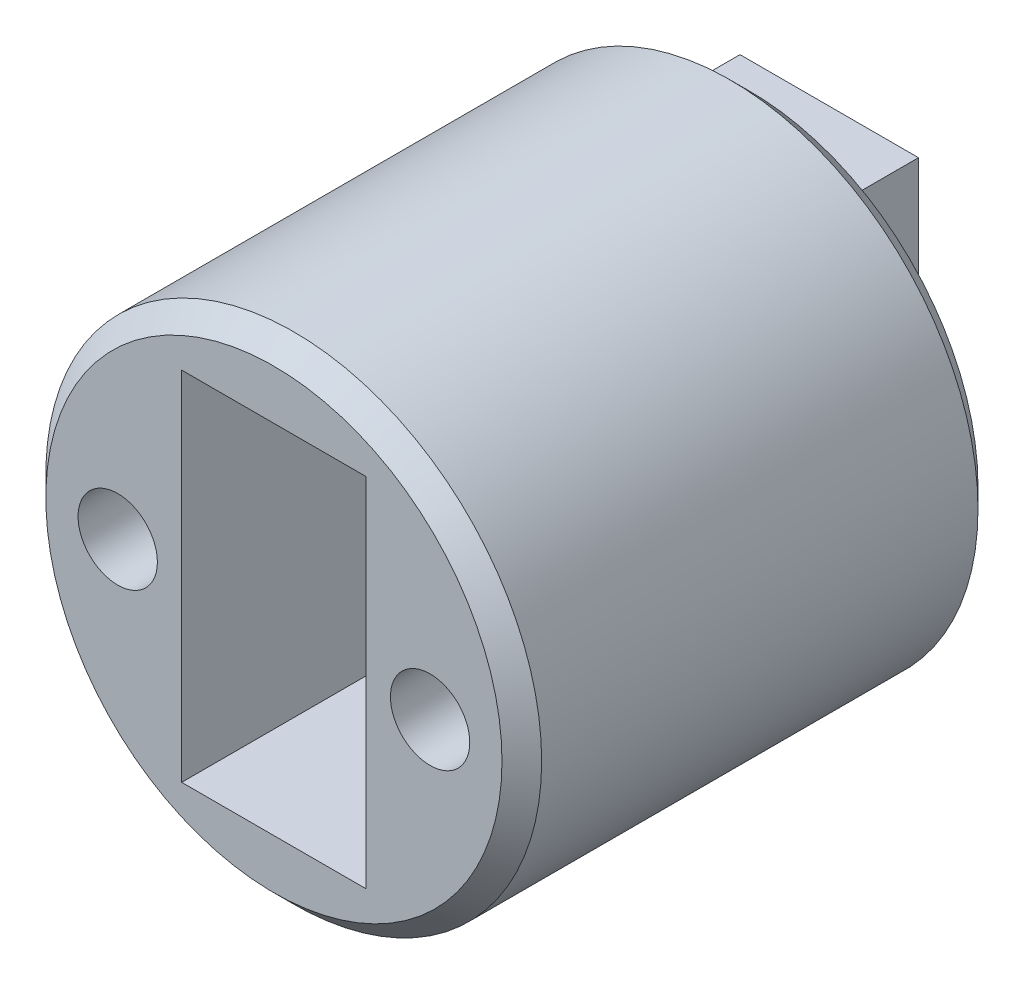
ISO-10303-21;
HEADER;
FILE_DESCRIPTION(('STEP AP214'),'2;1');
FILE_NAME('part.step','',(''),(''),'','','');
FILE_SCHEMA(('AUTOMOTIVE_DESIGN { 1 0 10303 214 1 1 1 1 }'));
ENDSEC;
DATA;
#1=APPLICATION_CONTEXT('core data for automotive mechanical design processes');
#2=APPLICATION_PROTOCOL_DEFINITION('international standard','automotive_design',2000,#1);
#3=PRODUCT_CONTEXT('',#1,'mechanical');
#4=PRODUCT('Part','Part','',(#3));
#5=PRODUCT_RELATED_PRODUCT_CATEGORY('part','',(#4));
#6=PRODUCT_DEFINITION_FORMATION('','',#4);
#7=PRODUCT_DEFINITION_CONTEXT('part definition',#1,'design');
#8=PRODUCT_DEFINITION('design','',#6,#7);
#9=PRODUCT_DEFINITION_SHAPE('','',#8);
#10=(LENGTH_UNIT() NAMED_UNIT(*) SI_UNIT(.MILLI.,.METRE.));
#11=(NAMED_UNIT(*) PLANE_ANGLE_UNIT() SI_UNIT($,.RADIAN.));
#12=(NAMED_UNIT(*) SI_UNIT($,.STERADIAN.) SOLID_ANGLE_UNIT());
#13=UNCERTAINTY_MEASURE_WITH_UNIT(LENGTH_MEASURE(1.E-05),#10,'distance_accuracy_value','');
#14=(GEOMETRIC_REPRESENTATION_CONTEXT(3) GLOBAL_UNCERTAINTY_ASSIGNED_CONTEXT((#13)) GLOBAL_UNIT_ASSIGNED_CONTEXT((#10,
#11,#12)) REPRESENTATION_CONTEXT('',''));
#15=CARTESIAN_POINT('',(0.,0.,0.));
#16=DIRECTION('',(0.,0.,1.));
#17=DIRECTION('',(1.,0.,0.));
#18=AXIS2_PLACEMENT_3D('',#15,#16,#17);
#19=CARTESIAN_POINT('',(0.,0.,6.));
#20=DIRECTION('',(0.,0.,1.));
#21=DIRECTION('',(1.,0.,0.));
#22=AXIS2_PLACEMENT_3D('',#19,#20,#21);
#23=PLANE('',#22);
#24=DIRECTION('',(-1.,0.,0.));
#25=VECTOR('',#24,1.);
#26=CARTESIAN_POINT('',(-3.,7.,6.));
#27=LINE('',#26,#25);
#28=CARTESIAN_POINT('',(2.69999999999997,7.,6.));
#29=VERTEX_POINT('',#28);
#30=CARTESIAN_POINT('',(-2.69999999999997,7.,6.));
#31=VERTEX_POINT('',#30);
#32=EDGE_CURVE('E196',#29,#31,#27,.T.);
#33=ORIENTED_EDGE('',*,*,#32,.F.);
#34=DIRECTION('',(0.,1.,0.));
#35=VECTOR('',#34,1.);
#36=CARTESIAN_POINT('',(2.69999999999997,0.,6.));
#37=LINE('',#36,#35);
#38=CARTESIAN_POINT('',(2.69999999999997,7.04999999999996,6.));
#39=VERTEX_POINT('',#38);
#40=EDGE_CURVE('E357',#29,#39,#37,.T.);
#41=ORIENTED_EDGE('',*,*,#40,.T.);
#42=DIRECTION('',(-1.,0.,0.));
#43=VECTOR('',#42,1.);
#44=CARTESIAN_POINT('',(0.,7.04999999999996,6.));
#45=LINE('',#44,#43);
#46=CARTESIAN_POINT('',(-2.69999999999997,7.04999999999996,6.));
#47=VERTEX_POINT('',#46);
#48=EDGE_CURVE('E354',#39,#47,#45,.T.);
#49=ORIENTED_EDGE('',*,*,#48,.T.);
#50=DIRECTION('',(0.,-1.,0.));
#51=VECTOR('',#50,1.);
#52=CARTESIAN_POINT('',(-2.69999999999997,0.,6.));
#53=LINE('',#52,#51);
#54=EDGE_CURVE('E351',#47,#31,#53,.T.);
#55=ORIENTED_EDGE('',*,*,#54,.T.);
#56=EDGE_LOOP('',(#33,#41,#49,#55));
#57=FACE_BOUND('',#56,.T.);
#58=ADVANCED_FACE('F40',(#57),#23,.T.);
#59=CARTESIAN_POINT('',(0.,0.,0.));
#60=DIRECTION('',(0.,0.,1.));
#61=DIRECTION('',(1.,0.,0.));
#62=AXIS2_PLACEMENT_3D('',#59,#60,#61);
#63=PLANE('',#62);
#64=CARTESIAN_POINT('',(-7.875,0.,0.));
#65=DIRECTION('',(0.,0.,1.));
#66=DIRECTION('',(1.,0.,0.));
#67=AXIS2_PLACEMENT_3D('',#64,#65,#66);
#68=CIRCLE('',#67,2.);
#69=CARTESIAN_POINT('',(-5.875,0.,0.));
#70=VERTEX_POINT('',#69);
#71=EDGE_CURVE('E225',#70,#70,#68,.T.);
#72=ORIENTED_EDGE('',*,*,#71,.T.);
#73=EDGE_LOOP('',(#72));
#74=FACE_BOUND('',#73,.T.);
#75=CARTESIAN_POINT('',(7.875,0.,0.));
#76=DIRECTION('',(0.,0.,1.));
#77=DIRECTION('',(1.,0.,0.));
#78=AXIS2_PLACEMENT_3D('',#75,#76,#77);
#79=CIRCLE('',#78,2.);
#80=CARTESIAN_POINT('',(9.875,0.,0.));
#81=VERTEX_POINT('',#80);
#82=EDGE_CURVE('E218',#81,#81,#79,.T.);
#83=ORIENTED_EDGE('',*,*,#82,.T.);
#84=EDGE_LOOP('',(#83));
#85=FACE_BOUND('',#84,.T.);
#86=CARTESIAN_POINT('',(0.,0.,0.));
#87=DIRECTION('',(0.,0.,1.));
#88=DIRECTION('',(1.,0.,0.));
#89=AXIS2_PLACEMENT_3D('',#86,#87,#88);
#90=CIRCLE('',#89,11.5);
#91=CARTESIAN_POINT('',(11.5,0.,0.));
#92=VERTEX_POINT('',#91);
#93=EDGE_CURVE('E329',#92,#92,#90,.F.);
#94=ORIENTED_EDGE('',*,*,#93,.T.);
#95=EDGE_LOOP('',(#94));
#96=FACE_BOUND('',#95,.T.);
#97=DIRECTION('',(0.,1.,0.));
#98=VECTOR('',#97,1.);
#99=CARTESIAN_POINT('',(-4.5,8.85,0.));
#100=LINE('',#99,#98);
#101=CARTESIAN_POINT('',(-4.5,-8.85,0.));
#102=VERTEX_POINT('',#101);
#103=CARTESIAN_POINT('',(-4.5,8.85,0.));
#104=VERTEX_POINT('',#103);
#105=EDGE_CURVE('E230',#102,#104,#100,.T.);
#106=ORIENTED_EDGE('',*,*,#105,.F.);
#107=DIRECTION('',(-1.,0.,0.));
#108=VECTOR('',#107,1.);
#109=CARTESIAN_POINT('',(4.5,-8.85,0.));
#110=LINE('',#109,#108);
#111=CARTESIAN_POINT('',(4.5,-8.85,0.));
#112=VERTEX_POINT('',#111);
#113=EDGE_CURVE('E243',#112,#102,#110,.T.);
#114=ORIENTED_EDGE('',*,*,#113,.F.);
#115=DIRECTION('',(0.,-1.,0.));
#116=VECTOR('',#115,1.);
#117=CARTESIAN_POINT('',(4.5,8.85,0.));
#118=LINE('',#117,#116);
#119=CARTESIAN_POINT('',(4.5,8.85,0.));
#120=VERTEX_POINT('',#119);
#121=EDGE_CURVE('E239',#120,#112,#118,.T.);
#122=ORIENTED_EDGE('',*,*,#121,.F.);
#123=DIRECTION('',(1.,0.,0.));
#124=VECTOR('',#123,1.);
#125=CARTESIAN_POINT('',(4.5,8.85,0.));
#126=LINE('',#125,#124);
#127=EDGE_CURVE('E234',#104,#120,#126,.T.);
#128=ORIENTED_EDGE('',*,*,#127,.F.);
#129=EDGE_LOOP('',(#106,#114,#122,#128));
#130=FACE_BOUND('',#129,.T.);
#131=ADVANCED_FACE('F457',(#74,#85,#96,#130),#63,.F.);
#132=CARTESIAN_POINT('',(0.,0.,24.));
#133=DIRECTION('',(0.,0.,-1.));
#134=DIRECTION('',(-1.,0.,0.));
#135=AXIS2_PLACEMENT_3D('',#132,#133,#134);
#136=CYLINDRICAL_SURFACE('',#135,12.5);
#137=CARTESIAN_POINT('',(0.,0.,23.));
#138=DIRECTION('',(0.,0.,1.));
#139=DIRECTION('',(1.,0.,0.));
#140=AXIS2_PLACEMENT_3D('',#137,#138,#139);
#141=CIRCLE('',#140,12.5);
#142=CARTESIAN_POINT('',(12.5,0.,23.));
#143=VERTEX_POINT('',#142);
#144=EDGE_CURVE('E337',#143,#143,#141,.F.);
#145=ORIENTED_EDGE('',*,*,#144,.T.);
#146=EDGE_LOOP('',(#145));
#147=FACE_BOUND('',#146,.T.);
#148=CARTESIAN_POINT('',(0.,0.,1.));
#149=DIRECTION('',(0.,0.,1.));
#150=DIRECTION('',(1.,0.,0.));
#151=AXIS2_PLACEMENT_3D('',#148,#149,#150);
#152=CIRCLE('',#151,12.5);
#153=CARTESIAN_POINT('',(12.5,0.,1.));
#154=VERTEX_POINT('',#153);
#155=EDGE_CURVE('E313',#154,#154,#152,.T.);
#156=ORIENTED_EDGE('',*,*,#155,.T.);
#157=EDGE_LOOP('',(#156));
#158=FACE_BOUND('',#157,.T.);
#159=ADVANCED_FACE('F464',(#147,#158),#136,.T.);
#160=CARTESIAN_POINT('',(0.,0.,24.));
#161=DIRECTION('',(0.,0.,1.));
#162=DIRECTION('',(1.,0.,0.));
#163=AXIS2_PLACEMENT_3D('',#160,#161,#162);
#164=PLANE('',#163);
#165=CARTESIAN_POINT('',(0.,0.,24.));
#166=DIRECTION('',(0.,0.,1.));
#167=DIRECTION('',(1.,0.,0.));
#168=AXIS2_PLACEMENT_3D('',#165,#166,#167);
#169=CIRCLE('',#168,11.5);
#170=CARTESIAN_POINT('',(11.5,0.,24.));
#171=VERTEX_POINT('',#170);
#172=EDGE_CURVE('E333',#171,#171,#169,.T.);
#173=ORIENTED_EDGE('',*,*,#172,.T.);
#174=EDGE_LOOP('',(#173));
#175=FACE_BOUND('',#174,.T.);
#176=CARTESIAN_POINT('',(-7.875,0.,24.));
#177=DIRECTION('',(0.,0.,1.));
#178=DIRECTION('',(1.,0.,0.));
#179=AXIS2_PLACEMENT_3D('',#176,#177,#178);
#180=CIRCLE('',#179,2.);
#181=CARTESIAN_POINT('',(-5.875,0.,24.));
#182=VERTEX_POINT('',#181);
#183=EDGE_CURVE('E214',#182,#182,#180,.T.);
#184=ORIENTED_EDGE('',*,*,#183,.F.);
#185=EDGE_LOOP('',(#184));
#186=FACE_BOUND('',#185,.T.);
#187=CARTESIAN_POINT('',(7.875,0.,24.));
#188=DIRECTION('',(0.,0.,1.));
#189=DIRECTION('',(-1.,0.,0.));
#190=AXIS2_PLACEMENT_3D('',#187,#188,#189);
#191=CIRCLE('',#190,2.);
#192=CARTESIAN_POINT('',(9.875,0.,24.));
#193=VERTEX_POINT('',#192);
#194=EDGE_CURVE('E209',#193,#193,#191,.T.);
#195=ORIENTED_EDGE('',*,*,#194,.F.);
#196=EDGE_LOOP('',(#195));
#197=FACE_BOUND('',#196,.T.);
#198=DIRECTION('',(0.,1.,0.));
#199=VECTOR('',#198,1.);
#200=CARTESIAN_POINT('',(4.65,9.,24.));
#201=LINE('',#200,#199);
#202=CARTESIAN_POINT('',(4.65,-9.,24.));
#203=VERTEX_POINT('',#202);
#204=CARTESIAN_POINT('',(4.65,9.,24.));
#205=VERTEX_POINT('',#204);
#206=EDGE_CURVE('E259',#203,#205,#201,.T.);
#207=ORIENTED_EDGE('',*,*,#206,.F.);
#208=DIRECTION('',(1.,0.,0.));
#209=VECTOR('',#208,1.);
#210=CARTESIAN_POINT('',(-4.65,-9.,24.));
#211=LINE('',#210,#209);
#212=CARTESIAN_POINT('',(-4.65,-9.,24.));
#213=VERTEX_POINT('',#212);
#214=EDGE_CURVE('E271',#213,#203,#211,.T.);
#215=ORIENTED_EDGE('',*,*,#214,.F.);
#216=DIRECTION('',(0.,-1.,0.));
#217=VECTOR('',#216,1.);
#218=CARTESIAN_POINT('',(-4.65,9.,24.));
#219=LINE('',#218,#217);
#220=CARTESIAN_POINT('',(-4.65,9.,24.));
#221=VERTEX_POINT('',#220);
#222=EDGE_CURVE('E267',#221,#213,#219,.T.);
#223=ORIENTED_EDGE('',*,*,#222,.F.);
#224=DIRECTION('',(-1.,0.,0.));
#225=VECTOR('',#224,1.);
#226=CARTESIAN_POINT('',(-4.65,9.,24.));
#227=LINE('',#226,#225);
#228=EDGE_CURVE('E263',#205,#221,#227,.T.);
#229=ORIENTED_EDGE('',*,*,#228,.F.);
#230=EDGE_LOOP('',(#207,#215,#223,#229));
#231=FACE_BOUND('',#230,.T.);
#232=ADVANCED_FACE('F425',(#175,#186,#197,#231),#164,.T.);
#233=CARTESIAN_POINT('',(4.65,9.,6.));
#234=DIRECTION('',(1.,0.,0.));
#235=DIRECTION('',(0.,1.,0.));
#236=AXIS2_PLACEMENT_3D('',#233,#234,#235);
#237=PLANE('',#236);
#238=DIRECTION('',(0.,0.,1.));
#239=VECTOR('',#238,1.);
#240=CARTESIAN_POINT('',(4.65,9.,6.));
#241=LINE('',#240,#239);
#242=CARTESIAN_POINT('',(4.65,9.,7.95000000000002));
#243=VERTEX_POINT('',#242);
#244=EDGE_CURVE('E275',#243,#205,#241,.T.);
#245=ORIENTED_EDGE('',*,*,#244,.F.);
#246=DIRECTION('',(0.,-1.,0.));
#247=VECTOR('',#246,1.);
#248=CARTESIAN_POINT('',(4.65,9.,7.95000000000002));
#249=LINE('',#248,#247);
#250=CARTESIAN_POINT('',(4.65,-9.,7.95000000000002));
#251=VERTEX_POINT('',#250);
#252=EDGE_CURVE('E360',#243,#251,#249,.T.);
#253=ORIENTED_EDGE('',*,*,#252,.T.);
#254=DIRECTION('',(0.,0.,1.));
#255=VECTOR('',#254,1.);
#256=CARTESIAN_POINT('',(4.65,-9.,6.));
#257=LINE('',#256,#255);
#258=EDGE_CURVE('E276',#251,#203,#257,.T.);
#259=ORIENTED_EDGE('',*,*,#258,.T.);
#260=ORIENTED_EDGE('',*,*,#206,.T.);
#261=EDGE_LOOP('',(#245,#253,#259,#260));
#262=FACE_BOUND('',#261,.T.);
#263=ADVANCED_FACE('F430',(#262),#237,.F.);
#264=CARTESIAN_POINT('',(-4.65,-9.,6.));
#265=DIRECTION('',(0.,-1.,0.));
#266=DIRECTION('',(0.,0.,-1.));
#267=AXIS2_PLACEMENT_3D('',#264,#265,#266);
#268=PLANE('',#267);
#269=ORIENTED_EDGE('',*,*,#258,.F.);
#270=DIRECTION('',(-1.,0.,0.));
#271=VECTOR('',#270,1.);
#272=CARTESIAN_POINT('',(-4.65,-9.,7.95000000000002));
#273=LINE('',#272,#271);
#274=CARTESIAN_POINT('',(-4.65,-9.,7.95000000000002));
#275=VERTEX_POINT('',#274);
#276=EDGE_CURVE('E367',#251,#275,#273,.T.);
#277=ORIENTED_EDGE('',*,*,#276,.T.);
#278=DIRECTION('',(0.,0.,1.));
#279=VECTOR('',#278,1.);
#280=CARTESIAN_POINT('',(-4.65,-9.,6.));
#281=LINE('',#280,#279);
#282=EDGE_CURVE('E280',#275,#213,#281,.T.);
#283=ORIENTED_EDGE('',*,*,#282,.T.);
#284=ORIENTED_EDGE('',*,*,#214,.T.);
#285=EDGE_LOOP('',(#269,#277,#283,#284));
#286=FACE_BOUND('',#285,.T.);
#287=ADVANCED_FACE('F428',(#286),#268,.F.);
#288=CARTESIAN_POINT('',(-4.65,9.,6.));
#289=DIRECTION('',(-1.,0.,0.));
#290=DIRECTION('',(0.,-1.,0.));
#291=AXIS2_PLACEMENT_3D('',#288,#289,#290);
#292=PLANE('',#291);
#293=ORIENTED_EDGE('',*,*,#282,.F.);
#294=DIRECTION('',(0.,1.,0.));
#295=VECTOR('',#294,1.);
#296=CARTESIAN_POINT('',(-4.65,9.,7.95000000000002));
#297=LINE('',#296,#295);
#298=CARTESIAN_POINT('',(-4.65,9.,7.95000000000002));
#299=VERTEX_POINT('',#298);
#300=EDGE_CURVE('E370',#275,#299,#297,.T.);
#301=ORIENTED_EDGE('',*,*,#300,.T.);
#302=DIRECTION('',(0.,0.,1.));
#303=VECTOR('',#302,1.);
#304=CARTESIAN_POINT('',(-4.65,9.,6.));
#305=LINE('',#304,#303);
#306=EDGE_CURVE('E283',#299,#221,#305,.T.);
#307=ORIENTED_EDGE('',*,*,#306,.T.);
#308=ORIENTED_EDGE('',*,*,#222,.T.);
#309=EDGE_LOOP('',(#293,#301,#307,#308));
#310=FACE_BOUND('',#309,.T.);
#311=ADVANCED_FACE('F416',(#310),#292,.F.);
#312=CARTESIAN_POINT('',(-4.65,9.,6.));
#313=DIRECTION('',(0.,1.,0.));
#314=DIRECTION('',(0.,0.,1.));
#315=AXIS2_PLACEMENT_3D('',#312,#313,#314);
#316=PLANE('',#315);
#317=ORIENTED_EDGE('',*,*,#306,.F.);
#318=DIRECTION('',(1.,0.,0.));
#319=VECTOR('',#318,1.);
#320=CARTESIAN_POINT('',(-4.65,9.,7.95000000000002));
#321=LINE('',#320,#319);
#322=EDGE_CURVE('E364',#299,#243,#321,.T.);
#323=ORIENTED_EDGE('',*,*,#322,.T.);
#324=ORIENTED_EDGE('',*,*,#244,.T.);
#325=ORIENTED_EDGE('',*,*,#228,.T.);
#326=EDGE_LOOP('',(#317,#323,#324,#325));
#327=FACE_BOUND('',#326,.T.);
#328=ADVANCED_FACE('F418',(#327),#316,.F.);
#329=DIRECTION('',(1.,0.,0.));
#330=VECTOR('',#329,1.);
#331=CARTESIAN_POINT('',(0.,-7.04999999999997,6.));
#332=LINE('',#331,#330);
#333=CARTESIAN_POINT('',(-2.69999999999997,-7.04999999999997,6.));
#334=VERTEX_POINT('',#333);
#335=CARTESIAN_POINT('',(2.69999999999997,-7.04999999999997,6.));
#336=VERTEX_POINT('',#335);
#337=EDGE_CURVE('E344',#334,#336,#332,.T.);
#338=ORIENTED_EDGE('',*,*,#337,.T.);
#339=DIRECTION('',(0.,1.,0.));
#340=VECTOR('',#339,1.);
#341=CARTESIAN_POINT('',(2.69999999999997,0.,6.));
#342=LINE('',#341,#340);
#343=CARTESIAN_POINT('',(2.69999999999997,-7.,6.));
#344=VERTEX_POINT('',#343);
#345=EDGE_CURVE('E347',#336,#344,#342,.T.);
#346=ORIENTED_EDGE('',*,*,#345,.T.);
#347=DIRECTION('',(1.,0.,0.));
#348=VECTOR('',#347,1.);
#349=CARTESIAN_POINT('',(-3.,-7.,6.));
#350=LINE('',#349,#348);
#351=CARTESIAN_POINT('',(-2.69999999999997,-7.,6.));
#352=VERTEX_POINT('',#351);
#353=EDGE_CURVE('E192',#352,#344,#350,.T.);
#354=ORIENTED_EDGE('',*,*,#353,.F.);
#355=DIRECTION('',(0.,-1.,0.));
#356=VECTOR('',#355,1.);
#357=CARTESIAN_POINT('',(-2.69999999999997,0.,6.));
#358=LINE('',#357,#356);
#359=EDGE_CURVE('E341',#352,#334,#358,.T.);
#360=ORIENTED_EDGE('',*,*,#359,.T.);
#361=EDGE_LOOP('',(#338,#346,#354,#360));
#362=FACE_BOUND('',#361,.T.);
#363=ADVANCED_FACE('F444',(#362),#23,.T.);
#364=CARTESIAN_POINT('',(-4.5,8.85,-5.));
#365=DIRECTION('',(1.,0.,0.));
#366=DIRECTION('',(0.,1.,0.));
#367=AXIS2_PLACEMENT_3D('',#364,#365,#366);
#368=PLANE('',#367);
#369=DIRECTION('',(0.,0.,1.));
#370=VECTOR('',#369,1.);
#371=CARTESIAN_POINT('',(-4.5,8.85,-5.));
#372=LINE('',#371,#370);
#373=CARTESIAN_POINT('',(-4.5,8.85,-4.));
#374=VERTEX_POINT('',#373);
#375=EDGE_CURVE('E256',#374,#104,#372,.T.);
#376=ORIENTED_EDGE('',*,*,#375,.F.);
#377=DIRECTION('',(0.,-1.,0.));
#378=VECTOR('',#377,1.);
#379=CARTESIAN_POINT('',(-4.5,-8.85,-4.));
#380=LINE('',#379,#378);
#381=CARTESIAN_POINT('',(-4.5,-8.85,-4.));
#382=VERTEX_POINT('',#381);
#383=EDGE_CURVE('E300',#374,#382,#380,.T.);
#384=ORIENTED_EDGE('',*,*,#383,.T.);
#385=DIRECTION('',(0.,0.,1.));
#386=VECTOR('',#385,1.);
#387=CARTESIAN_POINT('',(-4.5,-8.85,-5.));
#388=LINE('',#387,#386);
#389=EDGE_CURVE('E247',#382,#102,#388,.T.);
#390=ORIENTED_EDGE('',*,*,#389,.T.);
#391=ORIENTED_EDGE('',*,*,#105,.T.);
#392=EDGE_LOOP('',(#376,#384,#390,#391));
#393=FACE_BOUND('',#392,.T.);
#394=ADVANCED_FACE('F470',(#393),#368,.F.);
#395=CARTESIAN_POINT('',(4.5,8.85,-5.));
#396=DIRECTION('',(0.,-1.,0.));
#397=DIRECTION('',(0.,0.,-1.));
#398=AXIS2_PLACEMENT_3D('',#395,#396,#397);
#399=PLANE('',#398);
#400=DIRECTION('',(0.,0.,1.));
#401=VECTOR('',#400,1.);
#402=CARTESIAN_POINT('',(4.5,8.85,-5.));
#403=LINE('',#402,#401);
#404=CARTESIAN_POINT('',(4.5,8.85,-4.));
#405=VERTEX_POINT('',#404);
#406=EDGE_CURVE('E253',#405,#120,#403,.T.);
#407=ORIENTED_EDGE('',*,*,#406,.F.);
#408=DIRECTION('',(-1.,0.,0.));
#409=VECTOR('',#408,1.);
#410=CARTESIAN_POINT('',(-4.5,8.85,-4.));
#411=LINE('',#410,#409);
#412=EDGE_CURVE('E307',#405,#374,#411,.T.);
#413=ORIENTED_EDGE('',*,*,#412,.T.);
#414=ORIENTED_EDGE('',*,*,#375,.T.);
#415=ORIENTED_EDGE('',*,*,#127,.T.);
#416=EDGE_LOOP('',(#407,#413,#414,#415));
#417=FACE_BOUND('',#416,.T.);
#418=ADVANCED_FACE('F475',(#417),#399,.F.);
#419=CARTESIAN_POINT('',(4.5,8.85,-5.));
#420=DIRECTION('',(-1.,0.,0.));
#421=DIRECTION('',(0.,-1.,0.));
#422=AXIS2_PLACEMENT_3D('',#419,#420,#421);
#423=PLANE('',#422);
#424=DIRECTION('',(0.,0.,1.));
#425=VECTOR('',#424,1.);
#426=CARTESIAN_POINT('',(4.5,-8.85,-5.));
#427=LINE('',#426,#425);
#428=CARTESIAN_POINT('',(4.5,-8.85,-4.));
#429=VERTEX_POINT('',#428);
#430=EDGE_CURVE('E250',#429,#112,#427,.T.);
#431=ORIENTED_EDGE('',*,*,#430,.F.);
#432=DIRECTION('',(0.,1.,0.));
#433=VECTOR('',#432,1.);
#434=CARTESIAN_POINT('',(4.5,8.85,-4.));
#435=LINE('',#434,#433);
#436=EDGE_CURVE('E310',#429,#405,#435,.T.);
#437=ORIENTED_EDGE('',*,*,#436,.T.);
#438=ORIENTED_EDGE('',*,*,#406,.T.);
#439=ORIENTED_EDGE('',*,*,#121,.T.);
#440=EDGE_LOOP('',(#431,#437,#438,#439));
#441=FACE_BOUND('',#440,.T.);
#442=ADVANCED_FACE('F568',(#441),#423,.F.);
#443=CARTESIAN_POINT('',(4.5,-8.85,-5.));
#444=DIRECTION('',(0.,1.,0.));
#445=DIRECTION('',(0.,0.,1.));
#446=AXIS2_PLACEMENT_3D('',#443,#444,#445);
#447=PLANE('',#446);
#448=ORIENTED_EDGE('',*,*,#389,.F.);
#449=DIRECTION('',(1.,0.,0.));
#450=VECTOR('',#449,1.);
#451=CARTESIAN_POINT('',(4.5,-8.85,-4.));
#452=LINE('',#451,#450);
#453=EDGE_CURVE('E304',#382,#429,#452,.T.);
#454=ORIENTED_EDGE('',*,*,#453,.T.);
#455=ORIENTED_EDGE('',*,*,#430,.T.);
#456=ORIENTED_EDGE('',*,*,#113,.T.);
#457=EDGE_LOOP('',(#448,#454,#455,#456));
#458=FACE_BOUND('',#457,.T.);
#459=ADVANCED_FACE('F565',(#458),#447,.F.);
#460=CARTESIAN_POINT('',(0.,0.,-5.));
#461=DIRECTION('',(0.,0.,-1.));
#462=DIRECTION('',(-1.,0.,0.));
#463=AXIS2_PLACEMENT_3D('',#460,#461,#462);
#464=PLANE('',#463);
#465=DIRECTION('',(0.,1.,0.));
#466=VECTOR('',#465,1.);
#467=CARTESIAN_POINT('',(3.,7.,-5.));
#468=LINE('',#467,#466);
#469=CARTESIAN_POINT('',(3.,-7.,-5.));
#470=VERTEX_POINT('',#469);
#471=CARTESIAN_POINT('',(3.,7.,-5.));
#472=VERTEX_POINT('',#471);
#473=EDGE_CURVE('E172',#470,#472,#468,.T.);
#474=ORIENTED_EDGE('',*,*,#473,.T.);
#475=DIRECTION('',(-1.,0.,0.));
#476=VECTOR('',#475,1.);
#477=CARTESIAN_POINT('',(-3.,7.,-5.));
#478=LINE('',#477,#476);
#479=CARTESIAN_POINT('',(-3.,7.,-5.));
#480=VERTEX_POINT('',#479);
#481=EDGE_CURVE('E182',#472,#480,#478,.T.);
#482=ORIENTED_EDGE('',*,*,#481,.T.);
#483=DIRECTION('',(0.,-1.,0.));
#484=VECTOR('',#483,1.);
#485=CARTESIAN_POINT('',(-3.,7.,-5.));
#486=LINE('',#485,#484);
#487=CARTESIAN_POINT('',(-3.,-7.,-5.));
#488=VERTEX_POINT('',#487);
#489=EDGE_CURVE('E187',#480,#488,#486,.T.);
#490=ORIENTED_EDGE('',*,*,#489,.T.);
#491=DIRECTION('',(1.,0.,0.));
#492=VECTOR('',#491,1.);
#493=CARTESIAN_POINT('',(-3.,-7.,-5.));
#494=LINE('',#493,#492);
#495=EDGE_CURVE('E179',#488,#470,#494,.T.);
#496=ORIENTED_EDGE('',*,*,#495,.T.);
#497=EDGE_LOOP('',(#474,#482,#490,#496));
#498=FACE_BOUND('',#497,.T.);
#499=DIRECTION('',(-1.,0.,0.));
#500=VECTOR('',#499,1.);
#501=CARTESIAN_POINT('',(-4.5,-7.85000000000001,-5.));
#502=LINE('',#501,#500);
#503=CARTESIAN_POINT('',(3.5,-7.85000000000001,-5.));
#504=VERTEX_POINT('',#503);
#505=CARTESIAN_POINT('',(-3.50000000000001,-7.85000000000001,-5.));
#506=VERTEX_POINT('',#505);
#507=EDGE_CURVE('E293',#504,#506,#502,.T.);
#508=ORIENTED_EDGE('',*,*,#507,.T.);
#509=DIRECTION('',(0.,1.,0.));
#510=VECTOR('',#509,1.);
#511=CARTESIAN_POINT('',(-3.50000000000001,8.85,-5.));
#512=LINE('',#511,#510);
#513=CARTESIAN_POINT('',(-3.50000000000001,7.85000000000001,-5.));
#514=VERTEX_POINT('',#513);
#515=EDGE_CURVE('E296',#506,#514,#512,.T.);
#516=ORIENTED_EDGE('',*,*,#515,.T.);
#517=DIRECTION('',(1.,0.,0.));
#518=VECTOR('',#517,1.);
#519=CARTESIAN_POINT('',(4.5,7.85000000000001,-5.));
#520=LINE('',#519,#518);
#521=CARTESIAN_POINT('',(3.50000000000001,7.85000000000001,-5.));
#522=VERTEX_POINT('',#521);
#523=EDGE_CURVE('E290',#514,#522,#520,.T.);
#524=ORIENTED_EDGE('',*,*,#523,.T.);
#525=DIRECTION('',(0.,-1.,0.));
#526=VECTOR('',#525,1.);
#527=CARTESIAN_POINT('',(3.5,-8.85,-5.));
#528=LINE('',#527,#526);
#529=EDGE_CURVE('E279',#522,#504,#528,.T.);
#530=ORIENTED_EDGE('',*,*,#529,.T.);
#531=EDGE_LOOP('',(#508,#516,#524,#530));
#532=FACE_BOUND('',#531,.T.);
#533=ADVANCED_FACE('F189',(#498,#532),#464,.T.);
#534=CARTESIAN_POINT('',(3.5,0.,-5.));
#535=DIRECTION('',(0.70710678118655,0.,-0.707106781186545));
#536=DIRECTION('',(0.,1.,0.));
#537=AXIS2_PLACEMENT_3D('',#534,#535,#536);
#538=PLANE('',#537);
#539=DIRECTION('',(0.577350269189624,0.577350269189624,0.577350269189628));
#540=VECTOR('',#539,1.);
#541=CARTESIAN_POINT('',(0.883333333333348,5.23333333333335,-7.61666666666668));
#542=LINE('',#541,#540);
#543=EDGE_CURVE('E319',#405,#522,#542,.F.);
#544=ORIENTED_EDGE('',*,*,#543,.F.);
#545=ORIENTED_EDGE('',*,*,#436,.F.);
#546=DIRECTION('',(-0.577350269189624,0.577350269189624,-0.577350269189628));
#547=VECTOR('',#546,1.);
#548=CARTESIAN_POINT('',(0.883333333333348,-5.23333333333335,-7.61666666666667));
#549=LINE('',#548,#547);
#550=EDGE_CURVE('E235',#504,#429,#549,.F.);
#551=ORIENTED_EDGE('',*,*,#550,.F.);
#552=ORIENTED_EDGE('',*,*,#529,.F.);
#553=EDGE_LOOP('',(#544,#545,#551,#552));
#554=FACE_BOUND('',#553,.T.);
#555=ADVANCED_FACE('F513',(#554),#538,.T.);
#556=CARTESIAN_POINT('',(0.,-7.85000000000001,-5.));
#557=DIRECTION('',(0.,-0.70710678118655,-0.707106781186545));
#558=DIRECTION('',(1.,0.,0.));
#559=AXIS2_PLACEMENT_3D('',#556,#557,#558);
#560=PLANE('',#559);
#561=ORIENTED_EDGE('',*,*,#550,.T.);
#562=ORIENTED_EDGE('',*,*,#453,.F.);
#563=DIRECTION('',(0.577350269189624,0.577350269189624,-0.577350269189628));
#564=VECTOR('',#563,1.);
#565=CARTESIAN_POINT('',(-2.33333333333334,-6.68333333333334,-6.16666666666667));
#566=LINE('',#565,#564);
#567=EDGE_CURVE('E316',#506,#382,#566,.F.);
#568=ORIENTED_EDGE('',*,*,#567,.F.);
#569=ORIENTED_EDGE('',*,*,#507,.F.);
#570=EDGE_LOOP('',(#561,#562,#568,#569));
#571=FACE_BOUND('',#570,.T.);
#572=ADVANCED_FACE('F506',(#571),#560,.T.);
#573=CARTESIAN_POINT('',(0.,7.85000000000001,-5.));
#574=DIRECTION('',(0.,0.70710678118655,-0.707106781186545));
#575=DIRECTION('',(-1.,0.,0.));
#576=AXIS2_PLACEMENT_3D('',#573,#574,#575);
#577=PLANE('',#576);
#578=ORIENTED_EDGE('',*,*,#543,.T.);
#579=ORIENTED_EDGE('',*,*,#523,.F.);
#580=DIRECTION('',(-0.577350269189624,0.577350269189624,0.577350269189628));
#581=VECTOR('',#580,1.);
#582=CARTESIAN_POINT('',(-2.33333333333334,6.68333333333334,-6.16666666666667));
#583=LINE('',#582,#581);
#584=EDGE_CURVE('E229',#374,#514,#583,.F.);
#585=ORIENTED_EDGE('',*,*,#584,.F.);
#586=ORIENTED_EDGE('',*,*,#412,.F.);
#587=EDGE_LOOP('',(#578,#579,#585,#586));
#588=FACE_BOUND('',#587,.T.);
#589=ADVANCED_FACE('F499',(#588),#577,.T.);
#590=CARTESIAN_POINT('',(-3.50000000000001,0.,-5.));
#591=DIRECTION('',(-0.70710678118655,0.,-0.707106781186545));
#592=DIRECTION('',(0.,-1.,0.));
#593=AXIS2_PLACEMENT_3D('',#590,#591,#592);
#594=PLANE('',#593);
#595=ORIENTED_EDGE('',*,*,#567,.T.);
#596=ORIENTED_EDGE('',*,*,#383,.F.);
#597=ORIENTED_EDGE('',*,*,#584,.T.);
#598=ORIENTED_EDGE('',*,*,#515,.F.);
#599=EDGE_LOOP('',(#595,#596,#597,#598));
#600=FACE_BOUND('',#599,.T.);
#601=ADVANCED_FACE('F491',(#600),#594,.T.);
#602=CARTESIAN_POINT('',(0.,0.,1.));
#603=DIRECTION('',(0.,0.,1.));
#604=DIRECTION('',(1.,0.,0.));
#605=AXIS2_PLACEMENT_3D('',#602,#603,#604);
#606=CONICAL_SURFACE('',#605,12.5,0.78539816339745);
#607=ORIENTED_EDGE('',*,*,#93,.F.);
#608=EDGE_LOOP('',(#607));
#609=FACE_BOUND('',#608,.T.);
#610=ORIENTED_EDGE('',*,*,#155,.F.);
#611=EDGE_LOOP('',(#610));
#612=FACE_BOUND('',#611,.T.);
#613=ADVANCED_FACE('F498',(#609,#612),#606,.T.);
#614=CARTESIAN_POINT('',(7.875,0.,-5.));
#615=DIRECTION('',(0.,0.,1.));
#616=DIRECTION('',(1.,0.,0.));
#617=AXIS2_PLACEMENT_3D('',#614,#615,#616);
#618=CYLINDRICAL_SURFACE('',#617,2.);
#619=CARTESIAN_POINT('',(9.875,0.,24.));
#620=CARTESIAN_POINT('',(9.875,0.,23.75));
#621=CARTESIAN_POINT('',(9.875,0.,23.5));
#622=CARTESIAN_POINT('',(9.875,0.,23.));
#623=CARTESIAN_POINT('',(9.875,0.,22.75));
#624=CARTESIAN_POINT('',(9.875,0.,22.25));
#625=CARTESIAN_POINT('',(9.875,0.,22.));
#626=CARTESIAN_POINT('',(9.875,0.,21.5));
#627=CARTESIAN_POINT('',(9.875,0.,21.25));
#628=CARTESIAN_POINT('',(9.875,0.,20.75));
#629=CARTESIAN_POINT('',(9.875,0.,20.5));
#630=CARTESIAN_POINT('',(9.875,0.,20.));
#631=CARTESIAN_POINT('',(9.875,0.,19.75));
#632=CARTESIAN_POINT('',(9.875,0.,19.25));
#633=CARTESIAN_POINT('',(9.875,0.,19.));
#634=CARTESIAN_POINT('',(9.875,0.,18.5));
#635=CARTESIAN_POINT('',(9.875,0.,18.25));
#636=CARTESIAN_POINT('',(9.875,0.,17.75));
#637=CARTESIAN_POINT('',(9.875,0.,17.5));
#638=CARTESIAN_POINT('',(9.875,0.,17.));
#639=CARTESIAN_POINT('',(9.875,0.,16.75));
#640=CARTESIAN_POINT('',(9.875,0.,16.25));
#641=CARTESIAN_POINT('',(9.875,0.,16.));
#642=CARTESIAN_POINT('',(9.875,0.,15.5));
#643=CARTESIAN_POINT('',(9.875,0.,15.25));
#644=CARTESIAN_POINT('',(9.875,0.,14.75));
#645=CARTESIAN_POINT('',(9.875,0.,14.5));
#646=CARTESIAN_POINT('',(9.875,0.,14.));
#647=CARTESIAN_POINT('',(9.875,0.,13.75));
#648=CARTESIAN_POINT('',(9.875,0.,13.25));
#649=CARTESIAN_POINT('',(9.875,0.,13.));
#650=CARTESIAN_POINT('',(9.875,0.,12.5));
#651=CARTESIAN_POINT('',(9.875,0.,12.25));
#652=CARTESIAN_POINT('',(9.875,0.,11.75));
#653=CARTESIAN_POINT('',(9.875,0.,11.5));
#654=CARTESIAN_POINT('',(9.875,0.,11.));
#655=CARTESIAN_POINT('',(9.875,0.,10.75));
#656=CARTESIAN_POINT('',(9.875,0.,10.25));
#657=CARTESIAN_POINT('',(9.875,0.,10.));
#658=CARTESIAN_POINT('',(9.875,0.,9.5));
#659=CARTESIAN_POINT('',(9.875,0.,9.25));
#660=CARTESIAN_POINT('',(9.875,0.,8.75));
#661=CARTESIAN_POINT('',(9.875,0.,8.5));
#662=CARTESIAN_POINT('',(9.875,0.,8.));
#663=CARTESIAN_POINT('',(9.875,0.,7.75));
#664=CARTESIAN_POINT('',(9.875,0.,7.25));
#665=CARTESIAN_POINT('',(9.875,0.,7.));
#666=CARTESIAN_POINT('',(9.875,0.,6.5));
#667=CARTESIAN_POINT('',(9.875,0.,6.25));
#668=CARTESIAN_POINT('',(9.875,0.,5.75));
#669=CARTESIAN_POINT('',(9.875,0.,5.5));
#670=CARTESIAN_POINT('',(9.875,0.,5.));
#671=CARTESIAN_POINT('',(9.875,0.,4.75));
#672=CARTESIAN_POINT('',(9.875,0.,4.25));
#673=CARTESIAN_POINT('',(9.875,0.,4.));
#674=CARTESIAN_POINT('',(9.875,0.,3.5));
#675=CARTESIAN_POINT('',(9.875,0.,3.25));
#676=CARTESIAN_POINT('',(9.875,0.,2.75));
#677=CARTESIAN_POINT('',(9.875,0.,2.5));
#678=CARTESIAN_POINT('',(9.875,0.,2.));
#679=CARTESIAN_POINT('',(9.875,0.,1.75));
#680=CARTESIAN_POINT('',(9.875,0.,1.25));
#681=CARTESIAN_POINT('',(9.875,0.,1.));
#682=CARTESIAN_POINT('',(9.875,0.,0.5));
#683=CARTESIAN_POINT('',(9.875,0.,0.25));
#684=CARTESIAN_POINT('',(9.875,0.,0.));
#685=B_SPLINE_CURVE_WITH_KNOTS('',3,(#619,#620,#621,#622,#623,#624,#625,#626,#627,#628,#629,
#630,#631,#632,#633,#634,#635,#636,#637,#638,#639,#640,#641,#642,#643,#644,#645,#646,#647,#648,
#649,#650,#651,#652,#653,#654,#655,#656,#657,#658,#659,#660,#661,#662,#663,#664,#665,#666,#667,
#668,#669,#670,#671,#672,#673,#674,#675,#676,#677,#678,#679,#680,#681,#682,#683,#684),
.UNSPECIFIED.,.F.,.F.,(4,2,2,2,2,2,2,2,2,2,2,2,2,2,2,2,2,2,2,2,2,2,2,2,2,2,2,2,2,2,2,2,4),(0.,
0.750000000000001,1.5,2.25,3.,3.75,4.5,5.25,6.,6.75,7.5,8.25,9.,9.75,10.5,11.25,12.,12.75,13.5,
14.25,15.,15.75,16.5,17.25,18.,18.75,19.5,20.25,21.,21.75,22.5,23.25,24.),.UNSPECIFIED.);
#686=EDGE_CURVE('BSEAM525',#193,#81,#685,.T.);
#687=ORIENTED_EDGE('',*,*,#194,.T.);
#688=ORIENTED_EDGE('',*,*,#82,.F.);
#689=ORIENTED_EDGE('',*,*,#686,.T.);
#690=ORIENTED_EDGE('',*,*,#686,.F.);
#691=EDGE_LOOP('',(#687,#689,#688,#690));
#692=FACE_BOUND('',#691,.T.);
#693=ADVANCED_FACE('F525',(#692),#618,.F.);
#694=CARTESIAN_POINT('',(-7.875,0.,-5.));
#695=DIRECTION('',(0.,0.,1.));
#696=DIRECTION('',(1.,0.,0.));
#697=AXIS2_PLACEMENT_3D('',#694,#695,#696);
#698=CYLINDRICAL_SURFACE('',#697,2.);
#699=CARTESIAN_POINT('',(-5.875,0.,24.));
#700=CARTESIAN_POINT('',(-5.875,0.,23.75));
#701=CARTESIAN_POINT('',(-5.875,0.,23.5));
#702=CARTESIAN_POINT('',(-5.875,0.,23.));
#703=CARTESIAN_POINT('',(-5.875,0.,22.75));
#704=CARTESIAN_POINT('',(-5.875,0.,22.25));
#705=CARTESIAN_POINT('',(-5.875,0.,22.));
#706=CARTESIAN_POINT('',(-5.875,0.,21.5));
#707=CARTESIAN_POINT('',(-5.875,0.,21.25));
#708=CARTESIAN_POINT('',(-5.875,0.,20.75));
#709=CARTESIAN_POINT('',(-5.875,0.,20.5));
#710=CARTESIAN_POINT('',(-5.875,0.,20.));
#711=CARTESIAN_POINT('',(-5.875,0.,19.75));
#712=CARTESIAN_POINT('',(-5.875,0.,19.25));
#713=CARTESIAN_POINT('',(-5.875,0.,19.));
#714=CARTESIAN_POINT('',(-5.875,0.,18.5));
#715=CARTESIAN_POINT('',(-5.875,0.,18.25));
#716=CARTESIAN_POINT('',(-5.875,0.,17.75));
#717=CARTESIAN_POINT('',(-5.875,0.,17.5));
#718=CARTESIAN_POINT('',(-5.875,0.,17.));
#719=CARTESIAN_POINT('',(-5.875,0.,16.75));
#720=CARTESIAN_POINT('',(-5.875,0.,16.25));
#721=CARTESIAN_POINT('',(-5.875,0.,16.));
#722=CARTESIAN_POINT('',(-5.875,0.,15.5));
#723=CARTESIAN_POINT('',(-5.875,0.,15.25));
#724=CARTESIAN_POINT('',(-5.875,0.,14.75));
#725=CARTESIAN_POINT('',(-5.875,0.,14.5));
#726=CARTESIAN_POINT('',(-5.875,0.,14.));
#727=CARTESIAN_POINT('',(-5.875,0.,13.75));
#728=CARTESIAN_POINT('',(-5.875,0.,13.25));
#729=CARTESIAN_POINT('',(-5.875,0.,13.));
#730=CARTESIAN_POINT('',(-5.875,0.,12.5));
#731=CARTESIAN_POINT('',(-5.875,0.,12.25));
#732=CARTESIAN_POINT('',(-5.875,0.,11.75));
#733=CARTESIAN_POINT('',(-5.875,0.,11.5));
#734=CARTESIAN_POINT('',(-5.875,0.,11.));
#735=CARTESIAN_POINT('',(-5.875,0.,10.75));
#736=CARTESIAN_POINT('',(-5.875,0.,10.25));
#737=CARTESIAN_POINT('',(-5.875,0.,10.));
#738=CARTESIAN_POINT('',(-5.875,0.,9.5));
#739=CARTESIAN_POINT('',(-5.875,0.,9.25));
#740=CARTESIAN_POINT('',(-5.875,0.,8.75));
#741=CARTESIAN_POINT('',(-5.875,0.,8.5));
#742=CARTESIAN_POINT('',(-5.875,0.,8.));
#743=CARTESIAN_POINT('',(-5.875,0.,7.75));
#744=CARTESIAN_POINT('',(-5.875,0.,7.25));
#745=CARTESIAN_POINT('',(-5.875,0.,7.));
#746=CARTESIAN_POINT('',(-5.875,0.,6.5));
#747=CARTESIAN_POINT('',(-5.875,0.,6.25));
#748=CARTESIAN_POINT('',(-5.875,0.,5.75));
#749=CARTESIAN_POINT('',(-5.875,0.,5.5));
#750=CARTESIAN_POINT('',(-5.875,0.,5.));
#751=CARTESIAN_POINT('',(-5.875,0.,4.75));
#752=CARTESIAN_POINT('',(-5.875,0.,4.25));
#753=CARTESIAN_POINT('',(-5.875,0.,4.));
#754=CARTESIAN_POINT('',(-5.875,0.,3.5));
#755=CARTESIAN_POINT('',(-5.875,0.,3.25));
#756=CARTESIAN_POINT('',(-5.875,0.,2.75));
#757=CARTESIAN_POINT('',(-5.875,0.,2.5));
#758=CARTESIAN_POINT('',(-5.875,0.,2.));
#759=CARTESIAN_POINT('',(-5.875,0.,1.75));
#760=CARTESIAN_POINT('',(-5.875,0.,1.25));
#761=CARTESIAN_POINT('',(-5.875,0.,1.));
#762=CARTESIAN_POINT('',(-5.875,0.,0.5));
#763=CARTESIAN_POINT('',(-5.875,0.,0.25));
#764=CARTESIAN_POINT('',(-5.875,0.,0.));
#765=B_SPLINE_CURVE_WITH_KNOTS('',3,(#699,#700,#701,#702,#703,#704,#705,#706,#707,#708,#709,
#710,#711,#712,#713,#714,#715,#716,#717,#718,#719,#720,#721,#722,#723,#724,#725,#726,#727,#728,
#729,#730,#731,#732,#733,#734,#735,#736,#737,#738,#739,#740,#741,#742,#743,#744,#745,#746,#747,
#748,#749,#750,#751,#752,#753,#754,#755,#756,#757,#758,#759,#760,#761,#762,#763,#764),
.UNSPECIFIED.,.F.,.F.,(4,2,2,2,2,2,2,2,2,2,2,2,2,2,2,2,2,2,2,2,2,2,2,2,2,2,2,2,2,2,2,2,4),(0.,
0.750000000000001,1.5,2.25,3.,3.75,4.5,5.25,6.,6.75,7.5,8.25,9.,9.75,10.5,11.25,12.,12.75,13.5,
14.25,15.,15.75,16.5,17.25,18.,18.75,19.5,20.25,21.,21.75,22.5,23.25,24.),.UNSPECIFIED.);
#766=EDGE_CURVE('BSEAM531',#182,#70,#765,.T.);
#767=ORIENTED_EDGE('',*,*,#183,.T.);
#768=ORIENTED_EDGE('',*,*,#71,.F.);
#769=ORIENTED_EDGE('',*,*,#766,.T.);
#770=ORIENTED_EDGE('',*,*,#766,.F.);
#771=EDGE_LOOP('',(#767,#769,#768,#770));
#772=FACE_BOUND('',#771,.T.);
#773=ADVANCED_FACE('F531',(#772),#698,.F.);
#774=CARTESIAN_POINT('',(0.,0.,24.));
#775=DIRECTION('',(0.,0.,-1.));
#776=DIRECTION('',(-1.,0.,0.));
#777=AXIS2_PLACEMENT_3D('',#774,#775,#776);
#778=CONICAL_SURFACE('',#777,11.5,0.785398163397443);
#779=ORIENTED_EDGE('',*,*,#144,.F.);
#780=EDGE_LOOP('',(#779));
#781=FACE_BOUND('',#780,.T.);
#782=ORIENTED_EDGE('',*,*,#172,.F.);
#783=EDGE_LOOP('',(#782));
#784=FACE_BOUND('',#783,.T.);
#785=ADVANCED_FACE('F454',(#781,#784),#778,.T.);
#786=CARTESIAN_POINT('',(3.,7.,-5.));
#787=DIRECTION('',(1.,0.,0.));
#788=DIRECTION('',(0.,1.,0.));
#789=AXIS2_PLACEMENT_3D('',#786,#787,#788);
#790=PLANE('',#789);
#791=DIRECTION('',(0.,0.,1.));
#792=VECTOR('',#791,1.);
#793=CARTESIAN_POINT('',(3.,-7.,-5.));
#794=LINE('',#793,#792);
#795=CARTESIAN_POINT('',(3.,-7.,6.30000000000003));
#796=VERTEX_POINT('',#795);
#797=EDGE_CURVE('E206',#470,#796,#794,.T.);
#798=ORIENTED_EDGE('',*,*,#797,.T.);
#799=DIRECTION('',(0.,1.,0.));
#800=VECTOR('',#799,1.);
#801=CARTESIAN_POINT('',(3.,7.,6.30000000000003));
#802=LINE('',#801,#800);
#803=CARTESIAN_POINT('',(3.,7.,6.30000000000003));
#804=VERTEX_POINT('',#803);
#805=EDGE_CURVE('E175',#796,#804,#802,.T.);
#806=ORIENTED_EDGE('',*,*,#805,.T.);
#807=DIRECTION('',(0.,0.,1.));
#808=VECTOR('',#807,1.);
#809=CARTESIAN_POINT('',(3.,7.,-5.));
#810=LINE('',#809,#808);
#811=EDGE_CURVE('E168',#472,#804,#810,.T.);
#812=ORIENTED_EDGE('',*,*,#811,.F.);
#813=ORIENTED_EDGE('',*,*,#473,.F.);
#814=EDGE_LOOP('',(#798,#806,#812,#813));
#815=FACE_BOUND('',#814,.T.);
#816=ADVANCED_FACE('F170',(#815),#790,.F.);
#817=CARTESIAN_POINT('',(-3.,-7.,-5.));
#818=DIRECTION('',(0.,-1.,0.));
#819=DIRECTION('',(0.,0.,-1.));
#820=AXIS2_PLACEMENT_3D('',#817,#818,#819);
#821=PLANE('',#820);
#822=DIRECTION('',(0.,0.,1.));
#823=VECTOR('',#822,1.);
#824=CARTESIAN_POINT('',(-3.,-7.,-5.));
#825=LINE('',#824,#823);
#826=CARTESIAN_POINT('',(-3.,-7.,6.30000000000003));
#827=VERTEX_POINT('',#826);
#828=EDGE_CURVE('E58',#488,#827,#825,.T.);
#829=ORIENTED_EDGE('',*,*,#828,.T.);
#830=DIRECTION('',(0.707106781186551,0.,-0.707106781186544));
#831=VECTOR('',#830,1.);
#832=CARTESIAN_POINT('',(2.65000000000002,-7.,0.650000000000073));
#833=LINE('',#832,#831);
#834=EDGE_CURVE('E11',#827,#352,#833,.T.);
#835=ORIENTED_EDGE('',*,*,#834,.T.);
#836=ORIENTED_EDGE('',*,*,#353,.T.);
#837=DIRECTION('',(0.707106781186551,0.,0.707106781186544));
#838=VECTOR('',#837,1.);
#839=CARTESIAN_POINT('',(-5.65000000000005,-7.,-2.34999999999993));
#840=LINE('',#839,#838);
#841=EDGE_CURVE('E373',#344,#796,#840,.T.);
#842=ORIENTED_EDGE('',*,*,#841,.T.);
#843=ORIENTED_EDGE('',*,*,#797,.F.);
#844=ORIENTED_EDGE('',*,*,#495,.F.);
#845=EDGE_LOOP('',(#829,#835,#836,#842,#843,#844));
#846=FACE_BOUND('',#845,.T.);
#847=ADVANCED_FACE('F445',(#846),#821,.F.);
#848=CARTESIAN_POINT('',(-3.,7.,-5.));
#849=DIRECTION('',(-1.,0.,0.));
#850=DIRECTION('',(0.,-1.,0.));
#851=AXIS2_PLACEMENT_3D('',#848,#849,#850);
#852=PLANE('',#851);
#853=DIRECTION('',(0.,0.,1.));
#854=VECTOR('',#853,1.);
#855=CARTESIAN_POINT('',(-3.,7.,-5.));
#856=LINE('',#855,#854);
#857=CARTESIAN_POINT('',(-3.,7.,6.30000000000003));
#858=VERTEX_POINT('',#857);
#859=EDGE_CURVE('E65',#480,#858,#856,.T.);
#860=ORIENTED_EDGE('',*,*,#859,.T.);
#861=DIRECTION('',(0.,-1.,0.));
#862=VECTOR('',#861,1.);
#863=CARTESIAN_POINT('',(-3.,7.,6.30000000000003));
#864=LINE('',#863,#862);
#865=EDGE_CURVE('E51',#858,#827,#864,.T.);
#866=ORIENTED_EDGE('',*,*,#865,.T.);
#867=ORIENTED_EDGE('',*,*,#828,.F.);
#868=ORIENTED_EDGE('',*,*,#489,.F.);
#869=EDGE_LOOP('',(#860,#866,#867,#868));
#870=FACE_BOUND('',#869,.T.);
#871=ADVANCED_FACE('F447',(#870),#852,.F.);
#872=CARTESIAN_POINT('',(-3.,7.,-5.));
#873=DIRECTION('',(0.,1.,0.));
#874=DIRECTION('',(0.,0.,1.));
#875=AXIS2_PLACEMENT_3D('',#872,#873,#874);
#876=PLANE('',#875);
#877=ORIENTED_EDGE('',*,*,#811,.T.);
#878=DIRECTION('',(-0.707106781186551,0.,-0.707106781186544));
#879=VECTOR('',#878,1.);
#880=CARTESIAN_POINT('',(-5.65000000000005,7.,-2.34999999999993));
#881=LINE('',#880,#879);
#882=EDGE_CURVE('E379',#804,#29,#881,.T.);
#883=ORIENTED_EDGE('',*,*,#882,.T.);
#884=ORIENTED_EDGE('',*,*,#32,.T.);
#885=DIRECTION('',(-0.707106781186551,0.,0.707106781186544));
#886=VECTOR('',#885,1.);
#887=CARTESIAN_POINT('',(2.65000000000002,7.,0.650000000000073));
#888=LINE('',#887,#886);
#889=EDGE_CURVE('E382',#31,#858,#888,.T.);
#890=ORIENTED_EDGE('',*,*,#889,.T.);
#891=ORIENTED_EDGE('',*,*,#859,.F.);
#892=ORIENTED_EDGE('',*,*,#481,.F.);
#893=EDGE_LOOP('',(#877,#883,#884,#890,#891,#892));
#894=FACE_BOUND('',#893,.T.);
#895=ADVANCED_FACE('F183',(#894),#876,.F.);
#896=CARTESIAN_POINT('',(-2.69999999999997,0.,6.));
#897=DIRECTION('',(-0.707106781186544,0.,-0.707106781186551));
#898=DIRECTION('',(0.,-1.,0.));
#899=AXIS2_PLACEMENT_3D('',#896,#897,#898);
#900=PLANE('',#899);
#901=DIRECTION('',(-0.577350269189628,0.577350269189628,0.577350269189622));
#902=VECTOR('',#901,1.);
#903=CARTESIAN_POINT('',(-1.79999999999997,6.14999999999997,5.10000000000002));
#904=LINE('',#903,#902);
#905=EDGE_CURVE('E393',#299,#47,#904,.F.);
#906=ORIENTED_EDGE('',*,*,#905,.F.);
#907=ORIENTED_EDGE('',*,*,#300,.F.);
#908=DIRECTION('',(0.577350269189628,0.577350269189628,-0.577350269189622));
#909=VECTOR('',#908,1.);
#910=CARTESIAN_POINT('',(-1.79999999999997,-6.14999999999997,5.10000000000002));
#911=LINE('',#910,#909);
#912=EDGE_CURVE('E45',#334,#275,#911,.F.);
#913=ORIENTED_EDGE('',*,*,#912,.F.);
#914=ORIENTED_EDGE('',*,*,#359,.F.);
#915=ORIENTED_EDGE('',*,*,#834,.F.);
#916=ORIENTED_EDGE('',*,*,#865,.F.);
#917=ORIENTED_EDGE('',*,*,#889,.F.);
#918=ORIENTED_EDGE('',*,*,#54,.F.);
#919=EDGE_LOOP('',(#906,#907,#913,#914,#915,#916,#917,#918));
#920=FACE_BOUND('',#919,.T.);
#921=ADVANCED_FACE('F43',(#920),#900,.F.);
#922=CARTESIAN_POINT('',(0.,-7.04999999999997,6.));
#923=DIRECTION('',(0.,-0.707106781186544,-0.707106781186551));
#924=DIRECTION('',(1.,0.,0.));
#925=AXIS2_PLACEMENT_3D('',#922,#923,#924);
#926=PLANE('',#925);
#927=ORIENTED_EDGE('',*,*,#912,.T.);
#928=ORIENTED_EDGE('',*,*,#276,.F.);
#929=DIRECTION('',(-0.577350269189628,0.577350269189628,-0.577350269189622));
#930=VECTOR('',#929,1.);
#931=CARTESIAN_POINT('',(0.349999999999962,-4.69999999999996,3.65000000000002));
#932=LINE('',#931,#930);
#933=EDGE_CURVE('E391',#336,#251,#932,.F.);
#934=ORIENTED_EDGE('',*,*,#933,.F.);
#935=ORIENTED_EDGE('',*,*,#337,.F.);
#936=EDGE_LOOP('',(#927,#928,#934,#935));
#937=FACE_BOUND('',#936,.T.);
#938=ADVANCED_FACE('F406',(#937),#926,.F.);
#939=CARTESIAN_POINT('',(0.,7.04999999999996,6.));
#940=DIRECTION('',(0.,0.707106781186544,-0.707106781186551));
#941=DIRECTION('',(-1.,0.,0.));
#942=AXIS2_PLACEMENT_3D('',#939,#940,#941);
#943=PLANE('',#942);
#944=ORIENTED_EDGE('',*,*,#905,.T.);
#945=ORIENTED_EDGE('',*,*,#48,.F.);
#946=DIRECTION('',(0.577350269189628,0.577350269189628,0.577350269189622));
#947=VECTOR('',#946,1.);
#948=CARTESIAN_POINT('',(0.349999999999961,4.69999999999996,3.65000000000002));
#949=LINE('',#948,#947);
#950=EDGE_CURVE('E387',#243,#39,#949,.F.);
#951=ORIENTED_EDGE('',*,*,#950,.F.);
#952=ORIENTED_EDGE('',*,*,#322,.F.);
#953=EDGE_LOOP('',(#944,#945,#951,#952));
#954=FACE_BOUND('',#953,.T.);
#955=ADVANCED_FACE('F437',(#954),#943,.F.);
#956=CARTESIAN_POINT('',(2.69999999999997,0.,6.));
#957=DIRECTION('',(0.707106781186544,0.,-0.707106781186551));
#958=DIRECTION('',(0.,1.,0.));
#959=AXIS2_PLACEMENT_3D('',#956,#957,#958);
#960=PLANE('',#959);
#961=ORIENTED_EDGE('',*,*,#933,.T.);
#962=ORIENTED_EDGE('',*,*,#252,.F.);
#963=ORIENTED_EDGE('',*,*,#950,.T.);
#964=ORIENTED_EDGE('',*,*,#40,.F.);
#965=ORIENTED_EDGE('',*,*,#882,.F.);
#966=ORIENTED_EDGE('',*,*,#805,.F.);
#967=ORIENTED_EDGE('',*,*,#841,.F.);
#968=ORIENTED_EDGE('',*,*,#345,.F.);
#969=EDGE_LOOP('',(#961,#962,#963,#964,#965,#966,#967,#968));
#970=FACE_BOUND('',#969,.T.);
#971=ADVANCED_FACE('F434',(#970),#960,.F.);
#972=CLOSED_SHELL('',(#58,#131,#159,#232,#263,#287,#311,#328,#363,#394,#418,#442,#459,#533,#555,
#572,#589,#601,#613,#693,#773,#785,#816,#847,#871,#895,#921,#938,#955,#971));
#973=MANIFOLD_SOLID_BREP('B2',#972);
#974=ADVANCED_BREP_SHAPE_REPRESENTATION('',(#18,#973),#14);
#975=SHAPE_DEFINITION_REPRESENTATION(#9,#974);
ENDSEC;
END-ISO-10303-21;
